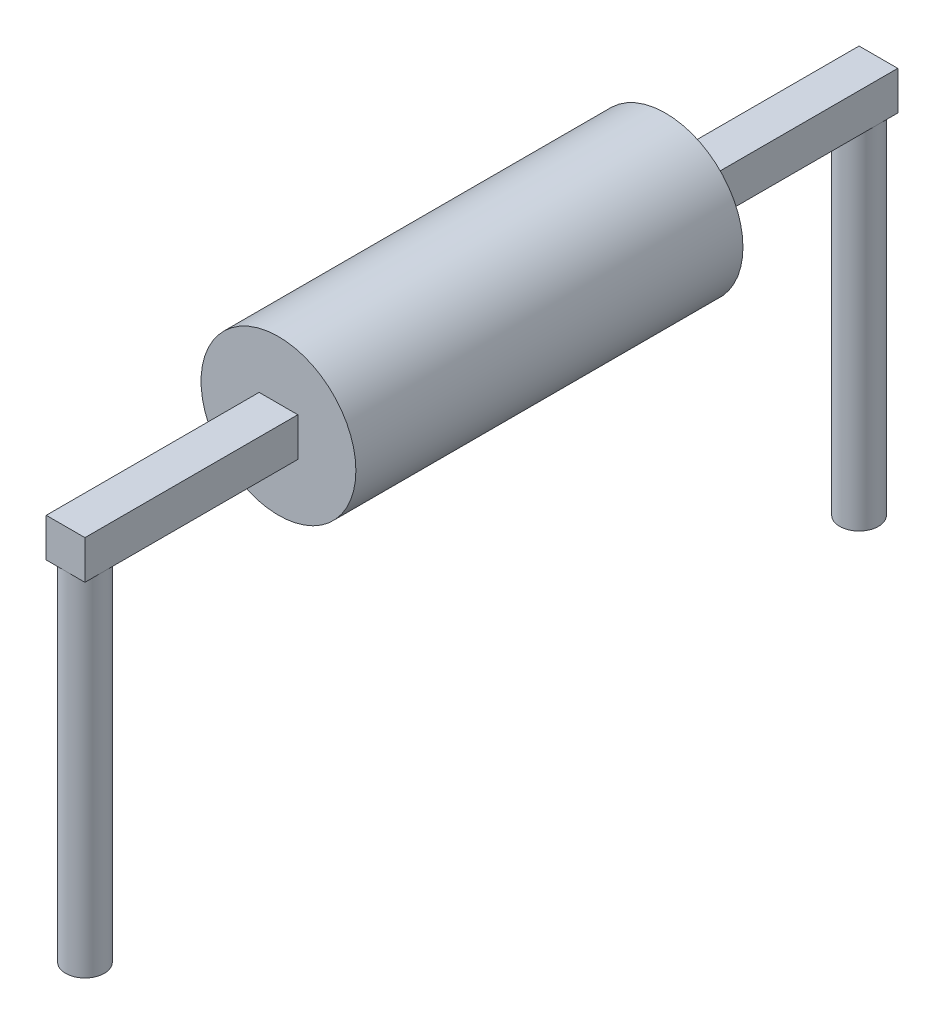
ISO-10303-21;
HEADER;
FILE_DESCRIPTION(('STEP AP214'),'2;1');
FILE_NAME('part.step','',(''),(''),'','','');
FILE_SCHEMA(('AUTOMOTIVE_DESIGN { 1 0 10303 214 1 1 1 1 }'));
ENDSEC;
DATA;
#1=APPLICATION_CONTEXT('core data for automotive mechanical design processes');
#2=APPLICATION_PROTOCOL_DEFINITION('international standard','automotive_design',2000,#1);
#3=PRODUCT_CONTEXT('',#1,'mechanical');
#4=PRODUCT('Part','Part','',(#3));
#5=PRODUCT_RELATED_PRODUCT_CATEGORY('part','',(#4));
#6=PRODUCT_DEFINITION_FORMATION('','',#4);
#7=PRODUCT_DEFINITION_CONTEXT('part definition',#1,'design');
#8=PRODUCT_DEFINITION('design','',#6,#7);
#9=PRODUCT_DEFINITION_SHAPE('','',#8);
#10=(LENGTH_UNIT() NAMED_UNIT(*) SI_UNIT(.MILLI.,.METRE.));
#11=(NAMED_UNIT(*) PLANE_ANGLE_UNIT() SI_UNIT($,.RADIAN.));
#12=(NAMED_UNIT(*) SI_UNIT($,.STERADIAN.) SOLID_ANGLE_UNIT());
#13=UNCERTAINTY_MEASURE_WITH_UNIT(LENGTH_MEASURE(1.E-05),#10,'distance_accuracy_value','');
#14=(GEOMETRIC_REPRESENTATION_CONTEXT(3) GLOBAL_UNCERTAINTY_ASSIGNED_CONTEXT((#13)) GLOBAL_UNIT_ASSIGNED_CONTEXT((#10,
#11,#12)) REPRESENTATION_CONTEXT('',''));
#15=CARTESIAN_POINT('',(0.,0.,0.));
#16=DIRECTION('',(0.,0.,1.));
#17=DIRECTION('',(1.,0.,0.));
#18=AXIS2_PLACEMENT_3D('',#15,#16,#17);
#19=CARTESIAN_POINT('',(-0.250117438522129,-0.25,7.75000000000001));
#20=DIRECTION('',(0.,1.,0.));
#21=DIRECTION('',(-0.999999999999999,0.,0.));
#22=AXIS2_PLACEMENT_3D('',#19,#20,#21);
#23=PLANE('',#22);
#24=CARTESIAN_POINT('',(0.,-0.249999999999999,-2.5));
#25=DIRECTION('',(0.,1.,0.));
#26=DIRECTION('',(-0.999999999999999,0.,0.));
#27=AXIS2_PLACEMENT_3D('',#24,#25,#26);
#28=CIRCLE('',#27,0.25);
#29=CARTESIAN_POINT('',(0.,-0.25,-2.75));
#30=VERTEX_POINT('',#29);
#31=CARTESIAN_POINT('',(0.249882561477871,-0.25,-2.5076619494428));
#32=VERTEX_POINT('',#31);
#33=EDGE_CURVE('E11',#30,#32,#28,.F.);
#34=ORIENTED_EDGE('',*,*,#33,.F.);
#35=DIRECTION('',(0.999999999999999,0.,0.));
#36=VECTOR('',#35,1.);
#37=CARTESIAN_POINT('',(-0.250117438522129,-0.25,-2.75));
#38=LINE('',#37,#36);
#39=CARTESIAN_POINT('',(0.249882561477871,-0.249999999999999,-2.75));
#40=VERTEX_POINT('',#39);
#41=EDGE_CURVE('E122',#30,#40,#38,.T.);
#42=ORIENTED_EDGE('',*,*,#41,.T.);
#43=DIRECTION('',(0.,0.,-1.));
#44=VECTOR('',#43,1.);
#45=CARTESIAN_POINT('',(0.249882561477871,-0.25,7.75000000000001));
#46=LINE('',#45,#44);
#47=EDGE_CURVE('E32',#32,#40,#46,.T.);
#48=ORIENTED_EDGE('',*,*,#47,.F.);
#49=EDGE_LOOP('',(#34,#42,#48));
#50=FACE_BOUND('',#49,.T.);
#51=ADVANCED_FACE('F28',(#50),#23,.F.);
#52=CARTESIAN_POINT('',(0.,-0.249999999999999,-2.5));
#53=DIRECTION('',(0.,-1.,0.));
#54=DIRECTION('',(0.999999999999999,0.,0.));
#55=AXIS2_PLACEMENT_3D('',#52,#53,#54);
#56=CIRCLE('',#55,0.25);
#57=CARTESIAN_POINT('',(0.249882561477871,-0.25,-2.49233805055721));
#58=VERTEX_POINT('',#57);
#59=EDGE_CURVE('E52',#58,#30,#56,.T.);
#60=ORIENTED_EDGE('',*,*,#59,.F.);
#61=CARTESIAN_POINT('',(0.249882561477871,-0.25,0.));
#62=VERTEX_POINT('',#61);
#63=EDGE_CURVE('E218',#62,#58,#46,.T.);
#64=ORIENTED_EDGE('',*,*,#63,.F.);
#65=DIRECTION('',(-0.999999999999999,0.,0.));
#66=VECTOR('',#65,1.);
#67=CARTESIAN_POINT('',(0.,-0.25,0.));
#68=LINE('',#67,#66);
#69=CARTESIAN_POINT('',(-0.250117438522129,-0.25,0.));
#70=VERTEX_POINT('',#69);
#71=EDGE_CURVE('E230',#62,#70,#68,.T.);
#72=ORIENTED_EDGE('',*,*,#71,.T.);
#73=DIRECTION('',(0.,0.,-1.));
#74=VECTOR('',#73,1.);
#75=CARTESIAN_POINT('',(-0.250117438522129,-0.25,7.75000000000001));
#76=LINE('',#75,#74);
#77=CARTESIAN_POINT('',(-0.250117438522129,-0.25,-2.75));
#78=VERTEX_POINT('',#77);
#79=EDGE_CURVE('E117',#70,#78,#76,.T.);
#80=ORIENTED_EDGE('',*,*,#79,.T.);
#81=EDGE_CURVE('E112',#78,#30,#38,.T.);
#82=ORIENTED_EDGE('',*,*,#81,.T.);
#83=EDGE_LOOP('',(#60,#64,#72,#80,#82));
#84=FACE_BOUND('',#83,.T.);
#85=ADVANCED_FACE('F114',(#84),#23,.F.);
#86=CARTESIAN_POINT('',(0.,-0.25,7.50000000000001));
#87=DIRECTION('',(0.,-1.,0.));
#88=DIRECTION('',(0.999999999999999,0.,0.));
#89=AXIS2_PLACEMENT_3D('',#86,#87,#88);
#90=CIRCLE('',#89,0.25);
#91=CARTESIAN_POINT('',(0.249882561477871,-0.25,7.50766194944277));
#92=VERTEX_POINT('',#91);
#93=CARTESIAN_POINT('',(0.,-0.25,7.75000000000001));
#94=VERTEX_POINT('',#93);
#95=EDGE_CURVE('E440',#92,#94,#90,.T.);
#96=ORIENTED_EDGE('',*,*,#95,.F.);
#97=CARTESIAN_POINT('',(0.249882561477871,-0.25,7.75000000000001));
#98=VERTEX_POINT('',#97);
#99=EDGE_CURVE('E211',#98,#92,#46,.T.);
#100=ORIENTED_EDGE('',*,*,#99,.F.);
#101=DIRECTION('',(0.999999999999999,0.,0.));
#102=VECTOR('',#101,1.);
#103=CARTESIAN_POINT('',(-0.250117438522129,-0.25,7.75000000000001));
#104=LINE('',#103,#102);
#105=EDGE_CURVE('E190',#94,#98,#104,.T.);
#106=ORIENTED_EDGE('',*,*,#105,.F.);
#107=EDGE_LOOP('',(#96,#100,#106));
#108=FACE_BOUND('',#107,.T.);
#109=ADVANCED_FACE('F290',(#108),#23,.F.);
#110=CARTESIAN_POINT('',(0.249882561477871,-0.25,7.49233805055721));
#111=VERTEX_POINT('',#110);
#112=EDGE_CURVE('E137',#94,#111,#90,.T.);
#113=ORIENTED_EDGE('',*,*,#112,.F.);
#114=CARTESIAN_POINT('',(-0.250117438522129,-0.25,7.75000000000001));
#115=VERTEX_POINT('',#114);
#116=EDGE_CURVE('E191',#115,#94,#104,.T.);
#117=ORIENTED_EDGE('',*,*,#116,.F.);
#118=CARTESIAN_POINT('',(-0.250117438522129,-0.249999999999999,5.));
#119=VERTEX_POINT('',#118);
#120=EDGE_CURVE('E206',#115,#119,#76,.T.);
#121=ORIENTED_EDGE('',*,*,#120,.T.);
#122=DIRECTION('',(-0.999999999999999,0.,0.));
#123=VECTOR('',#122,1.);
#124=CARTESIAN_POINT('',(0.,-0.249999999999999,5.));
#125=LINE('',#124,#123);
#126=CARTESIAN_POINT('',(0.249882561477871,-0.249999999999999,5.));
#127=VERTEX_POINT('',#126);
#128=EDGE_CURVE('E256',#127,#119,#125,.T.);
#129=ORIENTED_EDGE('',*,*,#128,.F.);
#130=EDGE_CURVE('E215',#111,#127,#46,.T.);
#131=ORIENTED_EDGE('',*,*,#130,.F.);
#132=EDGE_LOOP('',(#113,#117,#121,#129,#131));
#133=FACE_BOUND('',#132,.T.);
#134=ADVANCED_FACE('F257',(#133),#23,.F.);
#135=CARTESIAN_POINT('',(0.,0.,5.));
#136=DIRECTION('',(0.,0.,1.));
#137=DIRECTION('',(0.999999999999999,0.,0.));
#138=AXIS2_PLACEMENT_3D('',#135,#136,#137);
#139=PLANE('',#138);
#140=CARTESIAN_POINT('',(0.,0.,5.));
#141=DIRECTION('',(0.,0.,1.));
#142=DIRECTION('',(0.999999999999999,0.,0.));
#143=AXIS2_PLACEMENT_3D('',#140,#141,#142);
#144=CIRCLE('',#143,1.);
#145=CARTESIAN_POINT('',(0.999999999999999,0.,5.00000000000001));
#146=VERTEX_POINT('',#145);
#147=EDGE_CURVE('E270',#146,#146,#144,.T.);
#148=ORIENTED_EDGE('',*,*,#147,.T.);
#149=EDGE_LOOP('',(#148));
#150=FACE_BOUND('',#149,.T.);
#151=ORIENTED_EDGE('',*,*,#128,.T.);
#152=DIRECTION('',(0.,1.,0.));
#153=VECTOR('',#152,1.);
#154=CARTESIAN_POINT('',(-0.250117438522129,0.,5.));
#155=LINE('',#154,#153);
#156=CARTESIAN_POINT('',(-0.250117438522129,0.25,5.));
#157=VERTEX_POINT('',#156);
#158=EDGE_CURVE('E261',#119,#157,#155,.T.);
#159=ORIENTED_EDGE('',*,*,#158,.T.);
#160=DIRECTION('',(0.999999999999999,0.,0.));
#161=VECTOR('',#160,1.);
#162=CARTESIAN_POINT('',(0.,0.25,5.));
#163=LINE('',#162,#161);
#164=CARTESIAN_POINT('',(0.249882561477871,0.25,5.));
#165=VERTEX_POINT('',#164);
#166=EDGE_CURVE('E238',#157,#165,#163,.T.);
#167=ORIENTED_EDGE('',*,*,#166,.T.);
#168=DIRECTION('',(0.,-1.,0.));
#169=VECTOR('',#168,1.);
#170=CARTESIAN_POINT('',(0.249882561477871,0.,5.));
#171=LINE('',#170,#169);
#172=EDGE_CURVE('E250',#165,#127,#171,.T.);
#173=ORIENTED_EDGE('',*,*,#172,.T.);
#174=EDGE_LOOP('',(#151,#159,#167,#173));
#175=FACE_BOUND('',#174,.T.);
#176=ADVANCED_FACE('F263',(#150,#175),#139,.T.);
#177=CARTESIAN_POINT('',(0.,0.,0.));
#178=DIRECTION('',(0.,0.,1.));
#179=DIRECTION('',(0.999999999999999,0.,0.));
#180=AXIS2_PLACEMENT_3D('',#177,#178,#179);
#181=PLANE('',#180);
#182=CARTESIAN_POINT('',(0.,0.,0.));
#183=DIRECTION('',(0.,0.,1.));
#184=DIRECTION('',(0.999999999999999,0.,0.));
#185=AXIS2_PLACEMENT_3D('',#182,#183,#184);
#186=CIRCLE('',#185,1.);
#187=CARTESIAN_POINT('',(0.999999999999999,0.,0.));
#188=VERTEX_POINT('',#187);
#189=EDGE_CURVE('E267',#188,#188,#186,.T.);
#190=ORIENTED_EDGE('',*,*,#189,.F.);
#191=EDGE_LOOP('',(#190));
#192=FACE_BOUND('',#191,.T.);
#193=DIRECTION('',(0.,1.,0.));
#194=VECTOR('',#193,1.);
#195=CARTESIAN_POINT('',(-0.250117438522129,0.,0.));
#196=LINE('',#195,#194);
#197=CARTESIAN_POINT('',(-0.250117438522129,0.250000000000002,0.));
#198=VERTEX_POINT('',#197);
#199=EDGE_CURVE('E38',#70,#198,#196,.T.);
#200=ORIENTED_EDGE('',*,*,#199,.F.);
#201=ORIENTED_EDGE('',*,*,#71,.F.);
#202=DIRECTION('',(0.,-1.,0.));
#203=VECTOR('',#202,1.);
#204=CARTESIAN_POINT('',(0.249882561477871,0.,0.));
#205=LINE('',#204,#203);
#206=CARTESIAN_POINT('',(0.249882561477871,0.25,0.));
#207=VERTEX_POINT('',#206);
#208=EDGE_CURVE('E229',#207,#62,#205,.T.);
#209=ORIENTED_EDGE('',*,*,#208,.F.);
#210=DIRECTION('',(0.999999999999999,0.,0.));
#211=VECTOR('',#210,1.);
#212=CARTESIAN_POINT('',(0.,0.25,0.));
#213=LINE('',#212,#211);
#214=EDGE_CURVE('E273',#198,#207,#213,.T.);
#215=ORIENTED_EDGE('',*,*,#214,.F.);
#216=EDGE_LOOP('',(#200,#201,#209,#215));
#217=FACE_BOUND('',#216,.T.);
#218=ADVANCED_FACE('F298',(#192,#217),#181,.F.);
#219=CARTESIAN_POINT('',(0.,0.,5.));
#220=DIRECTION('',(0.,0.,-1.));
#221=DIRECTION('',(-0.999999999999999,0.,0.));
#222=AXIS2_PLACEMENT_3D('',#219,#220,#221);
#223=CYLINDRICAL_SURFACE('',#222,1.);
#224=ORIENTED_EDGE('',*,*,#147,.F.);
#225=EDGE_LOOP('',(#224));
#226=FACE_BOUND('',#225,.T.);
#227=ORIENTED_EDGE('',*,*,#189,.T.);
#228=EDGE_LOOP('',(#227));
#229=FACE_BOUND('',#228,.T.);
#230=ADVANCED_FACE('F30',(#226,#229),#223,.T.);
#231=CARTESIAN_POINT('',(-0.250117438522129,-0.25,-2.75));
#232=DIRECTION('',(0.,0.,-1.));
#233=DIRECTION('',(-0.999999999999999,0.,0.));
#234=AXIS2_PLACEMENT_3D('',#231,#232,#233);
#235=PLANE('',#234);
#236=DIRECTION('',(0.,-1.,0.));
#237=VECTOR('',#236,1.);
#238=CARTESIAN_POINT('',(-0.250117438522129,-0.25,-2.75));
#239=LINE('',#238,#237);
#240=CARTESIAN_POINT('',(-0.250117438522129,0.25,-2.75));
#241=VERTEX_POINT('',#240);
#242=EDGE_CURVE('E128',#241,#78,#239,.T.);
#243=ORIENTED_EDGE('',*,*,#242,.F.);
#244=DIRECTION('',(-0.999999999999999,0.,0.));
#245=VECTOR('',#244,1.);
#246=CARTESIAN_POINT('',(-0.250117438522129,0.25,-2.75));
#247=LINE('',#246,#245);
#248=CARTESIAN_POINT('',(0.249882561477871,0.25,-2.75));
#249=VERTEX_POINT('',#248);
#250=EDGE_CURVE('E184',#249,#241,#247,.T.);
#251=ORIENTED_EDGE('',*,*,#250,.F.);
#252=DIRECTION('',(0.,1.,0.));
#253=VECTOR('',#252,1.);
#254=CARTESIAN_POINT('',(0.249882561477871,-0.249999999999999,-2.75));
#255=LINE('',#254,#253);
#256=EDGE_CURVE('E121',#40,#249,#255,.T.);
#257=ORIENTED_EDGE('',*,*,#256,.F.);
#258=ORIENTED_EDGE('',*,*,#41,.F.);
#259=ORIENTED_EDGE('',*,*,#81,.F.);
#260=EDGE_LOOP('',(#243,#251,#257,#258,#259));
#261=FACE_BOUND('',#260,.T.);
#262=ADVANCED_FACE('F125',(#261),#235,.T.);
#263=CARTESIAN_POINT('',(-0.250117438522129,0.25,7.75000000000001));
#264=DIRECTION('',(0.,-1.,0.));
#265=DIRECTION('',(0.,0.,-1.));
#266=AXIS2_PLACEMENT_3D('',#263,#264,#265);
#267=PLANE('',#266);
#268=DIRECTION('',(0.,0.,-1.));
#269=VECTOR('',#268,1.);
#270=CARTESIAN_POINT('',(-0.250117438522129,0.25,7.75000000000001));
#271=LINE('',#270,#269);
#272=EDGE_CURVE('E198',#198,#241,#271,.T.);
#273=ORIENTED_EDGE('',*,*,#272,.F.);
#274=ORIENTED_EDGE('',*,*,#214,.T.);
#275=DIRECTION('',(0.,0.,-1.));
#276=VECTOR('',#275,1.);
#277=CARTESIAN_POINT('',(0.249882561477871,0.25,7.75000000000001));
#278=LINE('',#277,#276);
#279=EDGE_CURVE('E202',#207,#249,#278,.T.);
#280=ORIENTED_EDGE('',*,*,#279,.T.);
#281=ORIENTED_EDGE('',*,*,#250,.T.);
#282=EDGE_LOOP('',(#273,#274,#280,#281));
#283=FACE_BOUND('',#282,.T.);
#284=ADVANCED_FACE('F348',(#283),#267,.F.);
#285=CARTESIAN_POINT('',(0.249882561477871,-0.25,7.75000000000001));
#286=DIRECTION('',(-0.999999999999999,0.,0.));
#287=DIRECTION('',(0.,0.,1.));
#288=AXIS2_PLACEMENT_3D('',#285,#286,#287);
#289=PLANE('',#288);
#290=ORIENTED_EDGE('',*,*,#279,.F.);
#291=ORIENTED_EDGE('',*,*,#208,.T.);
#292=ORIENTED_EDGE('',*,*,#63,.T.);
#293=CARTESIAN_POINT('',(0.249882561477865,-0.25,-2.49233805055721));
#294=DIRECTION('',(0.,0.,-1.));
#295=VECTOR('',#294,1.);
#296=LINE('',#293,#295);
#297=EDGE_CURVE('E132',#58,#32,#296,.T.);
#298=ORIENTED_EDGE('',*,*,#297,.T.);
#299=ORIENTED_EDGE('',*,*,#47,.T.);
#300=ORIENTED_EDGE('',*,*,#256,.T.);
#301=EDGE_LOOP('',(#290,#291,#292,#298,#299,#300));
#302=FACE_BOUND('',#301,.T.);
#303=ADVANCED_FACE('F227',(#302),#289,.F.);
#304=CARTESIAN_POINT('',(-0.250117438522129,-0.25,7.75000000000001));
#305=DIRECTION('',(0.999999999999999,0.,0.));
#306=DIRECTION('',(0.,1.,0.));
#307=AXIS2_PLACEMENT_3D('',#304,#305,#306);
#308=PLANE('',#307);
#309=ORIENTED_EDGE('',*,*,#79,.F.);
#310=ORIENTED_EDGE('',*,*,#199,.T.);
#311=ORIENTED_EDGE('',*,*,#272,.T.);
#312=ORIENTED_EDGE('',*,*,#242,.T.);
#313=EDGE_LOOP('',(#309,#310,#311,#312));
#314=FACE_BOUND('',#313,.T.);
#315=ADVANCED_FACE('F235',(#314),#308,.F.);
#316=ORIENTED_EDGE('',*,*,#158,.F.);
#317=ORIENTED_EDGE('',*,*,#120,.F.);
#318=DIRECTION('',(0.,-1.,0.));
#319=VECTOR('',#318,1.);
#320=CARTESIAN_POINT('',(-0.250117438522129,-0.25,7.75000000000001));
#321=LINE('',#320,#319);
#322=CARTESIAN_POINT('',(-0.250117438522129,0.25,7.75000000000001));
#323=VERTEX_POINT('',#322);
#324=EDGE_CURVE('E187',#323,#115,#321,.T.);
#325=ORIENTED_EDGE('',*,*,#324,.F.);
#326=EDGE_CURVE('E199',#323,#157,#271,.T.);
#327=ORIENTED_EDGE('',*,*,#326,.T.);
#328=EDGE_LOOP('',(#316,#317,#325,#327));
#329=FACE_BOUND('',#328,.T.);
#330=ADVANCED_FACE('F289',(#329),#308,.F.);
#331=ORIENTED_EDGE('',*,*,#172,.F.);
#332=CARTESIAN_POINT('',(0.249882561477871,0.25,7.75000000000001));
#333=VERTEX_POINT('',#332);
#334=EDGE_CURVE('E203',#333,#165,#278,.T.);
#335=ORIENTED_EDGE('',*,*,#334,.F.);
#336=DIRECTION('',(0.,1.,0.));
#337=VECTOR('',#336,1.);
#338=CARTESIAN_POINT('',(0.249882561477871,-0.25,7.75000000000001));
#339=LINE('',#338,#337);
#340=EDGE_CURVE('E194',#98,#333,#339,.T.);
#341=ORIENTED_EDGE('',*,*,#340,.F.);
#342=ORIENTED_EDGE('',*,*,#99,.T.);
#343=CARTESIAN_POINT('',(0.,-0.25,7.50000000000001));
#344=DIRECTION('',(0.,-1.,0.));
#345=DIRECTION('',(0.999530245911438,0.,-0.0306477977711425));
#346=AXIS2_PLACEMENT_3D('',#343,#344,#345);
#347=CIRCLE('',#346,0.25);
#348=EDGE_CURVE('E181',#111,#92,#347,.T.);
#349=ORIENTED_EDGE('',*,*,#348,.F.);
#350=ORIENTED_EDGE('',*,*,#130,.T.);
#351=EDGE_LOOP('',(#331,#335,#341,#342,#349,#350));
#352=FACE_BOUND('',#351,.T.);
#353=ADVANCED_FACE('F247',(#352),#289,.F.);
#354=ORIENTED_EDGE('',*,*,#166,.F.);
#355=ORIENTED_EDGE('',*,*,#326,.F.);
#356=DIRECTION('',(-0.999999999999999,0.,0.));
#357=VECTOR('',#356,1.);
#358=CARTESIAN_POINT('',(-0.250117438522129,0.25,7.75000000000001));
#359=LINE('',#358,#357);
#360=EDGE_CURVE('E196',#333,#323,#359,.T.);
#361=ORIENTED_EDGE('',*,*,#360,.F.);
#362=ORIENTED_EDGE('',*,*,#334,.T.);
#363=EDGE_LOOP('',(#354,#355,#361,#362));
#364=FACE_BOUND('',#363,.T.);
#365=ADVANCED_FACE('F288',(#364),#267,.F.);
#366=CARTESIAN_POINT('',(-0.250117438522129,-0.25,7.75000000000001));
#367=DIRECTION('',(0.,0.,-1.));
#368=DIRECTION('',(-0.999999999999999,0.,0.));
#369=AXIS2_PLACEMENT_3D('',#366,#367,#368);
#370=PLANE('',#369);
#371=ORIENTED_EDGE('',*,*,#324,.T.);
#372=ORIENTED_EDGE('',*,*,#116,.T.);
#373=ORIENTED_EDGE('',*,*,#105,.T.);
#374=ORIENTED_EDGE('',*,*,#340,.T.);
#375=ORIENTED_EDGE('',*,*,#360,.T.);
#376=EDGE_LOOP('',(#371,#372,#373,#374,#375));
#377=FACE_BOUND('',#376,.T.);
#378=ADVANCED_FACE('F167',(#377),#370,.F.);
#379=CARTESIAN_POINT('',(0.,-4.75,7.50000000000001));
#380=DIRECTION('',(0.,1.,0.));
#381=DIRECTION('',(-0.999999999999999,0.,0.));
#382=AXIS2_PLACEMENT_3D('',#379,#380,#381);
#383=CYLINDRICAL_SURFACE('',#382,0.25);
#384=CARTESIAN_POINT('',(0.,-4.75,7.50000000000001));
#385=DIRECTION('',(0.,-1.,0.));
#386=DIRECTION('',(0.999999999999999,0.,0.));
#387=AXIS2_PLACEMENT_3D('',#384,#385,#386);
#388=CIRCLE('',#387,0.25);
#389=CARTESIAN_POINT('',(0.25,-4.75,7.50000000000001));
#390=VERTEX_POINT('',#389);
#391=EDGE_CURVE('E442',#390,#390,#388,.T.);
#392=ORIENTED_EDGE('',*,*,#391,.F.);
#393=EDGE_LOOP('',(#392));
#394=FACE_BOUND('',#393,.T.);
#395=ORIENTED_EDGE('',*,*,#95,.T.);
#396=ORIENTED_EDGE('',*,*,#112,.T.);
#397=ORIENTED_EDGE('',*,*,#348,.T.);
#398=EDGE_LOOP('',(#395,#396,#397));
#399=FACE_BOUND('',#398,.T.);
#400=ADVANCED_FACE('F162',(#394,#399),#383,.T.);
#401=CARTESIAN_POINT('',(0.,-4.75,7.50000000000001));
#402=DIRECTION('',(0.,-1.,0.));
#403=DIRECTION('',(0.999999999999999,0.,0.));
#404=AXIS2_PLACEMENT_3D('',#401,#402,#403);
#405=PLANE('',#404);
#406=ORIENTED_EDGE('',*,*,#391,.T.);
#407=EDGE_LOOP('',(#406));
#408=FACE_BOUND('',#407,.T.);
#409=ADVANCED_FACE('F158',(#408),#405,.T.);
#410=CARTESIAN_POINT('',(0.,-4.75,-2.5));
#411=DIRECTION('',(0.,1.,0.));
#412=DIRECTION('',(-0.999999999999999,0.,0.));
#413=AXIS2_PLACEMENT_3D('',#410,#411,#412);
#414=CYLINDRICAL_SURFACE('',#413,0.25);
#415=CARTESIAN_POINT('',(0.,-4.75,-2.5));
#416=DIRECTION('',(0.,-1.,0.));
#417=DIRECTION('',(0.999999999999999,0.,0.));
#418=AXIS2_PLACEMENT_3D('',#415,#416,#417);
#419=CIRCLE('',#418,0.25);
#420=CARTESIAN_POINT('',(0.25,-4.75,-2.5));
#421=VERTEX_POINT('',#420);
#422=EDGE_CURVE('E134',#421,#421,#419,.T.);
#423=ORIENTED_EDGE('',*,*,#422,.F.);
#424=EDGE_LOOP('',(#423));
#425=FACE_BOUND('',#424,.T.);
#426=ORIENTED_EDGE('',*,*,#59,.T.);
#427=ORIENTED_EDGE('',*,*,#33,.T.);
#428=ORIENTED_EDGE('',*,*,#297,.F.);
#429=EDGE_LOOP('',(#426,#427,#428));
#430=FACE_BOUND('',#429,.T.);
#431=ADVANCED_FACE('F131',(#425,#430),#414,.T.);
#432=CARTESIAN_POINT('',(0.,-4.75,-2.5));
#433=DIRECTION('',(0.,-1.,0.));
#434=DIRECTION('',(0.999999999999999,0.,0.));
#435=AXIS2_PLACEMENT_3D('',#432,#433,#434);
#436=PLANE('',#435);
#437=ORIENTED_EDGE('',*,*,#422,.T.);
#438=EDGE_LOOP('',(#437));
#439=FACE_BOUND('',#438,.T.);
#440=ADVANCED_FACE('F157',(#439),#436,.T.);
#441=CLOSED_SHELL('',(#51,#85,#109,#134,#176,#218,#230,#262,#284,#303,#315,#330,#353,#365,#378,
#400,#409,#431,#440));
#442=MANIFOLD_SOLID_BREP('B2',#441);
#443=ADVANCED_BREP_SHAPE_REPRESENTATION('',(#18,#442),#14);
#444=SHAPE_DEFINITION_REPRESENTATION(#9,#443);
ENDSEC;
END-ISO-10303-21;
